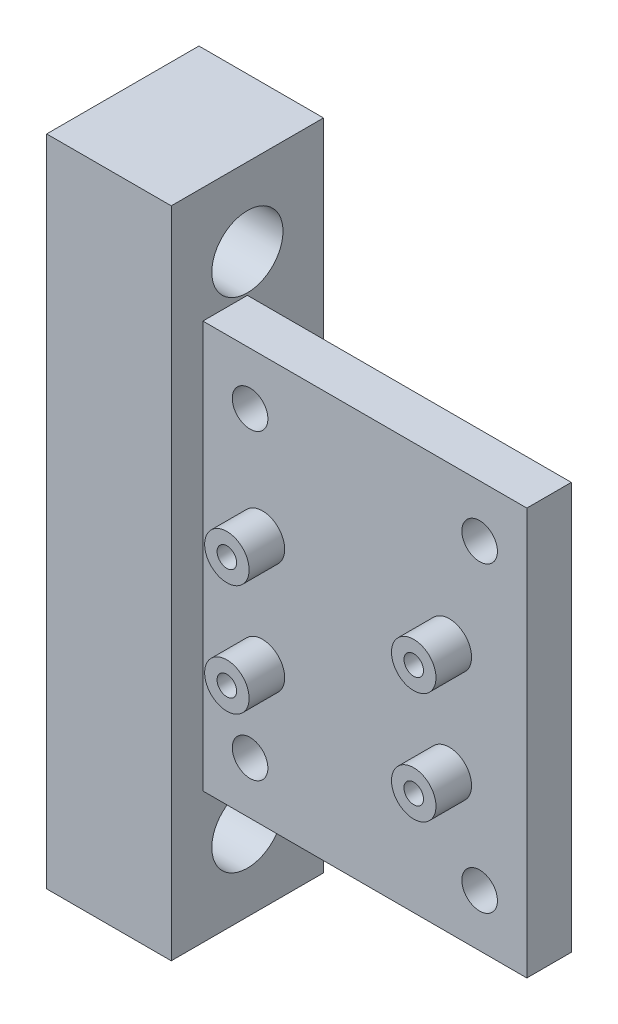
ISO-10303-21;
HEADER;
FILE_DESCRIPTION(('STEP AP214'),'2;1');
FILE_NAME('part.step','',(''),(''),'','','');
FILE_SCHEMA(('AUTOMOTIVE_DESIGN { 1 0 10303 214 1 1 1 1 }'));
ENDSEC;
DATA;
#1=APPLICATION_CONTEXT('core data for automotive mechanical design processes');
#2=APPLICATION_PROTOCOL_DEFINITION('international standard','automotive_design',2000,#1);
#3=PRODUCT_CONTEXT('',#1,'mechanical');
#4=PRODUCT('Part','Part','',(#3));
#5=PRODUCT_RELATED_PRODUCT_CATEGORY('part','',(#4));
#6=PRODUCT_DEFINITION_FORMATION('','',#4);
#7=PRODUCT_DEFINITION_CONTEXT('part definition',#1,'design');
#8=PRODUCT_DEFINITION('design','',#6,#7);
#9=PRODUCT_DEFINITION_SHAPE('','',#8);
#10=(LENGTH_UNIT() NAMED_UNIT(*) SI_UNIT(.MILLI.,.METRE.));
#11=(NAMED_UNIT(*) PLANE_ANGLE_UNIT() SI_UNIT($,.RADIAN.));
#12=(NAMED_UNIT(*) SI_UNIT($,.STERADIAN.) SOLID_ANGLE_UNIT());
#13=UNCERTAINTY_MEASURE_WITH_UNIT(LENGTH_MEASURE(1.E-05),#10,'distance_accuracy_value','');
#14=(GEOMETRIC_REPRESENTATION_CONTEXT(3) GLOBAL_UNCERTAINTY_ASSIGNED_CONTEXT((#13)) GLOBAL_UNIT_ASSIGNED_CONTEXT((#10,
#11,#12)) REPRESENTATION_CONTEXT('',''));
#15=CARTESIAN_POINT('',(0.,0.,0.));
#16=DIRECTION('',(0.,0.,1.));
#17=DIRECTION('',(1.,0.,0.));
#18=AXIS2_PLACEMENT_3D('',#15,#16,#17);
#19=CARTESIAN_POINT('',(0.,-21.9872067312742,5.));
#20=DIRECTION('',(0.,1.,0.));
#21=DIRECTION('',(0.,0.,1.));
#22=AXIS2_PLACEMENT_3D('',#19,#20,#21);
#23=PLANE('',#22);
#24=DIRECTION('',(1.,0.,0.));
#25=VECTOR('',#24,1.);
#26=CARTESIAN_POINT('',(0.,-21.9872067312742,0.));
#27=LINE('',#26,#25);
#28=CARTESIAN_POINT('',(-17.8933097400402,-21.9872067312742,0.));
#29=VERTEX_POINT('',#28);
#30=CARTESIAN_POINT('',(18.5125065993497,-21.9872067312742,0.));
#31=VERTEX_POINT('',#30);
#32=EDGE_CURVE('E217',#29,#31,#27,.T.);
#33=ORIENTED_EDGE('',*,*,#32,.T.);
#34=DIRECTION('',(0.,0.,-1.));
#35=VECTOR('',#34,1.);
#36=CARTESIAN_POINT('',(18.5125065993497,-21.9872067312742,5.));
#37=LINE('',#36,#35);
#38=CARTESIAN_POINT('',(18.5125065993497,-21.9872067312742,5.));
#39=VERTEX_POINT('',#38);
#40=EDGE_CURVE('E11',#39,#31,#37,.T.);
#41=ORIENTED_EDGE('',*,*,#40,.F.);
#42=DIRECTION('',(1.,0.,0.));
#43=VECTOR('',#42,1.);
#44=CARTESIAN_POINT('',(0.,-21.9872067312742,5.));
#45=LINE('',#44,#43);
#46=CARTESIAN_POINT('',(-17.8933097400402,-21.9872067312742,5.));
#47=VERTEX_POINT('',#46);
#48=EDGE_CURVE('E60',#47,#39,#45,.T.);
#49=ORIENTED_EDGE('',*,*,#48,.F.);
#50=DIRECTION('',(0.,0.,-1.));
#51=VECTOR('',#50,1.);
#52=CARTESIAN_POINT('',(-17.8933097400402,-21.9872067312742,5.));
#53=LINE('',#52,#51);
#54=EDGE_CURVE('E80',#47,#29,#53,.T.);
#55=ORIENTED_EDGE('',*,*,#54,.T.);
#56=EDGE_LOOP('',(#33,#41,#49,#55));
#57=FACE_BOUND('',#56,.T.);
#58=ADVANCED_FACE('F41',(#57),#23,.F.);
#59=CARTESIAN_POINT('',(18.5125065993497,0.,5.));
#60=DIRECTION('',(-1.,0.,0.));
#61=DIRECTION('',(0.,0.,1.));
#62=AXIS2_PLACEMENT_3D('',#59,#60,#61);
#63=PLANE('',#62);
#64=DIRECTION('',(0.,1.,0.));
#65=VECTOR('',#64,1.);
#66=CARTESIAN_POINT('',(18.5125065993497,0.,0.));
#67=LINE('',#66,#65);
#68=CARTESIAN_POINT('',(18.5125065993497,23.7506839774819,0.));
#69=VERTEX_POINT('',#68);
#70=EDGE_CURVE('E219',#31,#69,#67,.T.);
#71=ORIENTED_EDGE('',*,*,#70,.T.);
#72=DIRECTION('',(0.,0.,-1.));
#73=VECTOR('',#72,1.);
#74=CARTESIAN_POINT('',(18.5125065993497,23.7506839774819,5.));
#75=LINE('',#74,#73);
#76=CARTESIAN_POINT('',(18.5125065993497,23.7506839774819,5.));
#77=VERTEX_POINT('',#76);
#78=EDGE_CURVE('E51',#77,#69,#75,.T.);
#79=ORIENTED_EDGE('',*,*,#78,.F.);
#80=DIRECTION('',(0.,1.,0.));
#81=VECTOR('',#80,1.);
#82=CARTESIAN_POINT('',(18.5125065993497,0.,5.));
#83=LINE('',#82,#81);
#84=EDGE_CURVE('E86',#39,#77,#83,.T.);
#85=ORIENTED_EDGE('',*,*,#84,.F.);
#86=ORIENTED_EDGE('',*,*,#40,.T.);
#87=EDGE_LOOP('',(#71,#79,#85,#86));
#88=FACE_BOUND('',#87,.T.);
#89=ADVANCED_FACE('F281',(#88),#63,.F.);
#90=CARTESIAN_POINT('',(0.,23.7506839774819,5.));
#91=DIRECTION('',(0.,1.,0.));
#92=DIRECTION('',(0.,0.,1.));
#93=AXIS2_PLACEMENT_3D('',#90,#91,#92);
#94=PLANE('',#93);
#95=DIRECTION('',(1.,0.,0.));
#96=VECTOR('',#95,1.);
#97=CARTESIAN_POINT('',(0.,23.7506839774819,0.));
#98=LINE('',#97,#96);
#99=CARTESIAN_POINT('',(-17.8933097400402,23.7506839774819,0.));
#100=VERTEX_POINT('',#99);
#101=EDGE_CURVE('E221',#100,#69,#98,.T.);
#102=ORIENTED_EDGE('',*,*,#101,.F.);
#103=DIRECTION('',(0.,0.,-1.));
#104=VECTOR('',#103,1.);
#105=CARTESIAN_POINT('',(-17.8933097400402,23.7506839774819,5.));
#106=LINE('',#105,#104);
#107=CARTESIAN_POINT('',(-17.8933097400402,23.7506839774819,5.));
#108=VERTEX_POINT('',#107);
#109=EDGE_CURVE('E235',#108,#100,#106,.T.);
#110=ORIENTED_EDGE('',*,*,#109,.F.);
#111=DIRECTION('',(1.,0.,0.));
#112=VECTOR('',#111,1.);
#113=CARTESIAN_POINT('',(0.,23.7506839774819,5.));
#114=LINE('',#113,#112);
#115=EDGE_CURVE('E198',#108,#77,#114,.T.);
#116=ORIENTED_EDGE('',*,*,#115,.T.);
#117=ORIENTED_EDGE('',*,*,#78,.T.);
#118=EDGE_LOOP('',(#102,#110,#116,#117));
#119=FACE_BOUND('',#118,.T.);
#120=ADVANCED_FACE('F286',(#119),#94,.T.);
#121=CARTESIAN_POINT('',(9.80189714610748,6.1240373395566,5.));
#122=DIRECTION('',(0.,0.,-1.));
#123=DIRECTION('',(-1.,0.,0.));
#124=AXIS2_PLACEMENT_3D('',#121,#122,#123);
#125=CYLINDRICAL_SURFACE('',#124,1.1);
#126=CARTESIAN_POINT('',(9.80189714610748,6.1240373395566,0.));
#127=DIRECTION('',(0.,0.,1.));
#128=DIRECTION('',(1.,0.,0.));
#129=AXIS2_PLACEMENT_3D('',#126,#127,#128);
#130=CIRCLE('',#129,1.1);
#131=CARTESIAN_POINT('',(10.9018971461075,6.1240373395566,0.));
#132=VERTEX_POINT('',#131);
#133=EDGE_CURVE('E229',#132,#132,#130,.T.);
#134=ORIENTED_EDGE('',*,*,#133,.F.);
#135=EDGE_LOOP('',(#134));
#136=FACE_BOUND('',#135,.T.);
#137=CARTESIAN_POINT('',(9.80189714610748,6.1240373395566,9.));
#138=DIRECTION('',(0.,0.,1.));
#139=DIRECTION('',(1.,0.,0.));
#140=AXIS2_PLACEMENT_3D('',#137,#138,#139);
#141=CIRCLE('',#140,1.1);
#142=CARTESIAN_POINT('',(10.9018971461075,6.1240373395566,9.));
#143=VERTEX_POINT('',#142);
#144=EDGE_CURVE('E141',#143,#143,#141,.T.);
#145=ORIENTED_EDGE('',*,*,#144,.T.);
#146=EDGE_LOOP('',(#145));
#147=FACE_BOUND('',#146,.T.);
#148=ADVANCED_FACE('F483',(#136,#147),#125,.F.);
#149=CARTESIAN_POINT('',(-11.1981028538925,6.1240373395566,5.));
#150=DIRECTION('',(0.,0.,-1.));
#151=DIRECTION('',(-1.,0.,0.));
#152=AXIS2_PLACEMENT_3D('',#149,#150,#151);
#153=CYLINDRICAL_SURFACE('',#152,1.1);
#154=CARTESIAN_POINT('',(-11.1981028538925,6.1240373395566,0.));
#155=DIRECTION('',(0.,0.,1.));
#156=DIRECTION('',(1.,0.,0.));
#157=AXIS2_PLACEMENT_3D('',#154,#155,#156);
#158=CIRCLE('',#157,1.1);
#159=CARTESIAN_POINT('',(-10.0981028538925,6.1240373395566,0.));
#160=VERTEX_POINT('',#159);
#161=EDGE_CURVE('E226',#160,#160,#158,.T.);
#162=ORIENTED_EDGE('',*,*,#161,.F.);
#163=EDGE_LOOP('',(#162));
#164=FACE_BOUND('',#163,.T.);
#165=CARTESIAN_POINT('',(-11.1981028538925,6.1240373395566,9.));
#166=DIRECTION('',(0.,0.,1.));
#167=DIRECTION('',(1.,0.,0.));
#168=AXIS2_PLACEMENT_3D('',#165,#166,#167);
#169=CIRCLE('',#168,1.1);
#170=CARTESIAN_POINT('',(-10.0981028538925,6.1240373395566,9.));
#171=VERTEX_POINT('',#170);
#172=EDGE_CURVE('E155',#171,#171,#169,.T.);
#173=ORIENTED_EDGE('',*,*,#172,.T.);
#174=EDGE_LOOP('',(#173));
#175=FACE_BOUND('',#174,.T.);
#176=ADVANCED_FACE('F294',(#164,#175),#153,.F.);
#177=CARTESIAN_POINT('',(-12.5904015703453,17.8817386231038,5.));
#178=DIRECTION('',(0.,0.,-1.));
#179=DIRECTION('',(-1.,0.,0.));
#180=AXIS2_PLACEMENT_3D('',#177,#178,#179);
#181=CYLINDRICAL_SURFACE('',#180,2.);
#182=CARTESIAN_POINT('',(-12.5904015703453,17.8817386231038,5.));
#183=DIRECTION('',(0.,0.,1.));
#184=DIRECTION('',(1.,0.,0.));
#185=AXIS2_PLACEMENT_3D('',#182,#183,#184);
#186=CIRCLE('',#185,2.);
#187=CARTESIAN_POINT('',(-10.5904015703453,17.8817386231038,5.));
#188=VERTEX_POINT('',#187);
#189=EDGE_CURVE('E193',#188,#188,#186,.T.);
#190=ORIENTED_EDGE('',*,*,#189,.T.);
#191=EDGE_LOOP('',(#190));
#192=FACE_BOUND('',#191,.T.);
#193=CARTESIAN_POINT('',(-12.5904015703453,17.8817386231038,0.));
#194=DIRECTION('',(0.,0.,1.));
#195=DIRECTION('',(1.,0.,0.));
#196=AXIS2_PLACEMENT_3D('',#193,#194,#195);
#197=CIRCLE('',#196,2.);
#198=CARTESIAN_POINT('',(-10.5904015703453,17.8817386231038,0.));
#199=VERTEX_POINT('',#198);
#200=EDGE_CURVE('E214',#199,#199,#197,.T.);
#201=ORIENTED_EDGE('',*,*,#200,.F.);
#202=EDGE_LOOP('',(#201));
#203=FACE_BOUND('',#202,.T.);
#204=ADVANCED_FACE('F290',(#192,#203),#181,.F.);
#205=CARTESIAN_POINT('',(13.2095984296548,17.8817386231039,5.));
#206=DIRECTION('',(0.,0.,-1.));
#207=DIRECTION('',(-1.,0.,0.));
#208=AXIS2_PLACEMENT_3D('',#205,#206,#207);
#209=CYLINDRICAL_SURFACE('',#208,1.99999999999996);
#210=CARTESIAN_POINT('',(13.2095984296548,17.8817386231039,5.));
#211=DIRECTION('',(0.,0.,1.));
#212=DIRECTION('',(1.,0.,0.));
#213=AXIS2_PLACEMENT_3D('',#210,#211,#212);
#214=CIRCLE('',#213,1.99999999999996);
#215=CARTESIAN_POINT('',(15.2095984296547,17.8817386231039,5.));
#216=VERTEX_POINT('',#215);
#217=EDGE_CURVE('E190',#216,#216,#214,.T.);
#218=ORIENTED_EDGE('',*,*,#217,.T.);
#219=EDGE_LOOP('',(#218));
#220=FACE_BOUND('',#219,.T.);
#221=CARTESIAN_POINT('',(13.2095984296548,17.8817386231039,0.));
#222=DIRECTION('',(0.,0.,1.));
#223=DIRECTION('',(1.,0.,0.));
#224=AXIS2_PLACEMENT_3D('',#221,#222,#223);
#225=CIRCLE('',#224,1.99999999999996);
#226=CARTESIAN_POINT('',(15.2095984296547,17.8817386231039,0.));
#227=VERTEX_POINT('',#226);
#228=EDGE_CURVE('E211',#227,#227,#225,.T.);
#229=ORIENTED_EDGE('',*,*,#228,.F.);
#230=EDGE_LOOP('',(#229));
#231=FACE_BOUND('',#230,.T.);
#232=ADVANCED_FACE('F293',(#220,#231),#209,.F.);
#233=CARTESIAN_POINT('',(13.2095984296548,-16.1182613768961,5.));
#234=DIRECTION('',(0.,0.,-1.));
#235=DIRECTION('',(-1.,0.,0.));
#236=AXIS2_PLACEMENT_3D('',#233,#234,#235);
#237=CYLINDRICAL_SURFACE('',#236,2.);
#238=CARTESIAN_POINT('',(13.2095984296548,-16.1182613768961,5.));
#239=DIRECTION('',(0.,0.,1.));
#240=DIRECTION('',(1.,0.,0.));
#241=AXIS2_PLACEMENT_3D('',#238,#239,#240);
#242=CIRCLE('',#241,2.);
#243=CARTESIAN_POINT('',(15.2095984296548,-16.1182613768961,5.));
#244=VERTEX_POINT('',#243);
#245=EDGE_CURVE('E186',#244,#244,#242,.T.);
#246=ORIENTED_EDGE('',*,*,#245,.T.);
#247=EDGE_LOOP('',(#246));
#248=FACE_BOUND('',#247,.T.);
#249=CARTESIAN_POINT('',(13.2095984296548,-16.1182613768961,0.));
#250=DIRECTION('',(0.,0.,1.));
#251=DIRECTION('',(1.,0.,0.));
#252=AXIS2_PLACEMENT_3D('',#249,#250,#251);
#253=CIRCLE('',#252,2.);
#254=CARTESIAN_POINT('',(15.2095984296548,-16.1182613768961,0.));
#255=VERTEX_POINT('',#254);
#256=EDGE_CURVE('E208',#255,#255,#253,.T.);
#257=ORIENTED_EDGE('',*,*,#256,.F.);
#258=EDGE_LOOP('',(#257));
#259=FACE_BOUND('',#258,.T.);
#260=ADVANCED_FACE('F298',(#248,#259),#237,.F.);
#261=CARTESIAN_POINT('',(-12.5904015703453,-16.1182613768961,5.));
#262=DIRECTION('',(0.,0.,-1.));
#263=DIRECTION('',(-1.,0.,0.));
#264=AXIS2_PLACEMENT_3D('',#261,#262,#263);
#265=CYLINDRICAL_SURFACE('',#264,1.99999999999999);
#266=CARTESIAN_POINT('',(-12.5904015703453,-16.1182613768961,5.));
#267=DIRECTION('',(0.,0.,1.));
#268=DIRECTION('',(1.,0.,0.));
#269=AXIS2_PLACEMENT_3D('',#266,#267,#268);
#270=CIRCLE('',#269,1.99999999999999);
#271=CARTESIAN_POINT('',(-10.5904015703453,-16.1182613768961,5.));
#272=VERTEX_POINT('',#271);
#273=EDGE_CURVE('E183',#272,#272,#270,.T.);
#274=ORIENTED_EDGE('',*,*,#273,.T.);
#275=EDGE_LOOP('',(#274));
#276=FACE_BOUND('',#275,.T.);
#277=CARTESIAN_POINT('',(-12.5904015703453,-16.1182613768961,0.));
#278=DIRECTION('',(0.,0.,1.));
#279=DIRECTION('',(1.,0.,0.));
#280=AXIS2_PLACEMENT_3D('',#277,#278,#279);
#281=CIRCLE('',#280,1.99999999999999);
#282=CARTESIAN_POINT('',(-10.5904015703453,-16.1182613768961,0.));
#283=VERTEX_POINT('',#282);
#284=EDGE_CURVE('E205',#283,#283,#281,.T.);
#285=ORIENTED_EDGE('',*,*,#284,.F.);
#286=EDGE_LOOP('',(#285));
#287=FACE_BOUND('',#286,.T.);
#288=ADVANCED_FACE('F301',(#276,#287),#265,.F.);
#289=CARTESIAN_POINT('',(-11.1981028538925,-6.37596266044342,5.));
#290=DIRECTION('',(0.,0.,-1.));
#291=DIRECTION('',(-1.,0.,0.));
#292=AXIS2_PLACEMENT_3D('',#289,#290,#291);
#293=CYLINDRICAL_SURFACE('',#292,1.1);
#294=CARTESIAN_POINT('',(-11.1981028538925,-6.37596266044342,0.));
#295=DIRECTION('',(0.,0.,1.));
#296=DIRECTION('',(1.,0.,0.));
#297=AXIS2_PLACEMENT_3D('',#294,#295,#296);
#298=CIRCLE('',#297,1.1);
#299=CARTESIAN_POINT('',(-10.0981028538925,-6.37596266044342,0.));
#300=VERTEX_POINT('',#299);
#301=EDGE_CURVE('E180',#300,#300,#298,.T.);
#302=ORIENTED_EDGE('',*,*,#301,.F.);
#303=EDGE_LOOP('',(#302));
#304=FACE_BOUND('',#303,.T.);
#305=CARTESIAN_POINT('',(-11.1981028538925,-6.37596266044342,9.));
#306=DIRECTION('',(0.,0.,1.));
#307=DIRECTION('',(1.,0.,0.));
#308=AXIS2_PLACEMENT_3D('',#305,#306,#307);
#309=CIRCLE('',#308,1.1);
#310=CARTESIAN_POINT('',(-10.0981028538925,-6.37596266044342,9.));
#311=VERTEX_POINT('',#310);
#312=EDGE_CURVE('E152',#311,#311,#309,.T.);
#313=ORIENTED_EDGE('',*,*,#312,.T.);
#314=EDGE_LOOP('',(#313));
#315=FACE_BOUND('',#314,.T.);
#316=ADVANCED_FACE('F43',(#304,#315),#293,.F.);
#317=CARTESIAN_POINT('',(9.80189714610748,-6.37596266044337,5.));
#318=DIRECTION('',(0.,0.,-1.));
#319=DIRECTION('',(-1.,0.,0.));
#320=AXIS2_PLACEMENT_3D('',#317,#318,#319);
#321=CYLINDRICAL_SURFACE('',#320,1.1);
#322=CARTESIAN_POINT('',(9.80189714610748,-6.37596266044337,0.));
#323=DIRECTION('',(0.,0.,1.));
#324=DIRECTION('',(1.,0.,0.));
#325=AXIS2_PLACEMENT_3D('',#322,#323,#324);
#326=CIRCLE('',#325,1.1);
#327=CARTESIAN_POINT('',(10.9018971461075,-6.37596266044337,0.));
#328=VERTEX_POINT('',#327);
#329=EDGE_CURVE('E187',#328,#328,#326,.T.);
#330=ORIENTED_EDGE('',*,*,#329,.F.);
#331=EDGE_LOOP('',(#330));
#332=FACE_BOUND('',#331,.T.);
#333=CARTESIAN_POINT('',(9.80189714610748,-6.37596266044337,9.));
#334=DIRECTION('',(0.,0.,1.));
#335=DIRECTION('',(1.,0.,0.));
#336=AXIS2_PLACEMENT_3D('',#333,#334,#335);
#337=CIRCLE('',#336,1.1);
#338=CARTESIAN_POINT('',(10.9018971461075,-6.37596266044337,9.));
#339=VERTEX_POINT('',#338);
#340=EDGE_CURVE('E144',#339,#339,#337,.T.);
#341=ORIENTED_EDGE('',*,*,#340,.T.);
#342=EDGE_LOOP('',(#341));
#343=FACE_BOUND('',#342,.T.);
#344=ADVANCED_FACE('F308',(#332,#343),#321,.F.);
#345=CARTESIAN_POINT('',(0.,0.,5.));
#346=DIRECTION('',(0.,0.,1.));
#347=DIRECTION('',(1.,0.,0.));
#348=AXIS2_PLACEMENT_3D('',#345,#346,#347);
#349=PLANE('',#348);
#350=CARTESIAN_POINT('',(9.80189714610748,6.1240373395566,5.));
#351=DIRECTION('',(0.,0.,1.));
#352=DIRECTION('',(1.,0.,0.));
#353=AXIS2_PLACEMENT_3D('',#350,#351,#352);
#354=CIRCLE('',#353,2.5);
#355=CARTESIAN_POINT('',(12.3018971461075,6.1240373395566,5.));
#356=VERTEX_POINT('',#355);
#357=EDGE_CURVE('E159',#356,#356,#354,.T.);
#358=ORIENTED_EDGE('',*,*,#357,.F.);
#359=EDGE_LOOP('',(#358));
#360=FACE_BOUND('',#359,.T.);
#361=CARTESIAN_POINT('',(9.80189714610748,-6.37596266044337,5.));
#362=DIRECTION('',(0.,0.,1.));
#363=DIRECTION('',(1.,0.,0.));
#364=AXIS2_PLACEMENT_3D('',#361,#362,#363);
#365=CIRCLE('',#364,2.5);
#366=CARTESIAN_POINT('',(12.3018971461075,-6.37596266044337,5.));
#367=VERTEX_POINT('',#366);
#368=EDGE_CURVE('E165',#367,#367,#365,.T.);
#369=ORIENTED_EDGE('',*,*,#368,.F.);
#370=EDGE_LOOP('',(#369));
#371=FACE_BOUND('',#370,.T.);
#372=CARTESIAN_POINT('',(-11.1981028538925,-6.37596266044342,5.));
#373=DIRECTION('',(0.,0.,1.));
#374=DIRECTION('',(1.,0.,0.));
#375=AXIS2_PLACEMENT_3D('',#372,#373,#374);
#376=CIRCLE('',#375,2.5);
#377=CARTESIAN_POINT('',(-8.69810285389252,-6.37596266044342,5.));
#378=VERTEX_POINT('',#377);
#379=EDGE_CURVE('E171',#378,#378,#376,.T.);
#380=ORIENTED_EDGE('',*,*,#379,.F.);
#381=EDGE_LOOP('',(#380));
#382=FACE_BOUND('',#381,.T.);
#383=CARTESIAN_POINT('',(-11.1981028538925,6.1240373395566,5.));
#384=DIRECTION('',(0.,0.,1.));
#385=DIRECTION('',(1.,0.,0.));
#386=AXIS2_PLACEMENT_3D('',#383,#384,#385);
#387=CIRCLE('',#386,2.5);
#388=CARTESIAN_POINT('',(-8.69810285389252,6.1240373395566,5.));
#389=VERTEX_POINT('',#388);
#390=EDGE_CURVE('E174',#389,#389,#387,.T.);
#391=ORIENTED_EDGE('',*,*,#390,.F.);
#392=EDGE_LOOP('',(#391));
#393=FACE_BOUND('',#392,.T.);
#394=ORIENTED_EDGE('',*,*,#273,.F.);
#395=EDGE_LOOP('',(#394));
#396=FACE_BOUND('',#395,.T.);
#397=ORIENTED_EDGE('',*,*,#245,.F.);
#398=EDGE_LOOP('',(#397));
#399=FACE_BOUND('',#398,.T.);
#400=ORIENTED_EDGE('',*,*,#217,.F.);
#401=EDGE_LOOP('',(#400));
#402=FACE_BOUND('',#401,.T.);
#403=ORIENTED_EDGE('',*,*,#189,.F.);
#404=EDGE_LOOP('',(#403));
#405=FACE_BOUND('',#404,.T.);
#406=ORIENTED_EDGE('',*,*,#48,.T.);
#407=ORIENTED_EDGE('',*,*,#84,.T.);
#408=ORIENTED_EDGE('',*,*,#115,.F.);
#409=DIRECTION('',(0.,1.,0.));
#410=VECTOR('',#409,1.);
#411=CARTESIAN_POINT('',(-17.8933097400402,0.,5.));
#412=LINE('',#411,#410);
#413=EDGE_CURVE('E200',#47,#108,#412,.T.);
#414=ORIENTED_EDGE('',*,*,#413,.F.);
#415=EDGE_LOOP('',(#406,#407,#408,#414));
#416=FACE_BOUND('',#415,.T.);
#417=ADVANCED_FACE('F318',(#360,#371,#382,#393,#396,#399,#402,#405,#416),#349,.T.);
#418=CARTESIAN_POINT('',(0.,0.,0.));
#419=DIRECTION('',(0.,0.,1.));
#420=DIRECTION('',(1.,0.,0.));
#421=AXIS2_PLACEMENT_3D('',#418,#419,#420);
#422=PLANE('',#421);
#423=ORIENTED_EDGE('',*,*,#301,.T.);
#424=EDGE_LOOP('',(#423));
#425=FACE_BOUND('',#424,.T.);
#426=ORIENTED_EDGE('',*,*,#284,.T.);
#427=EDGE_LOOP('',(#426));
#428=FACE_BOUND('',#427,.T.);
#429=ORIENTED_EDGE('',*,*,#256,.T.);
#430=EDGE_LOOP('',(#429));
#431=FACE_BOUND('',#430,.T.);
#432=ORIENTED_EDGE('',*,*,#228,.T.);
#433=EDGE_LOOP('',(#432));
#434=FACE_BOUND('',#433,.T.);
#435=ORIENTED_EDGE('',*,*,#200,.T.);
#436=EDGE_LOOP('',(#435));
#437=FACE_BOUND('',#436,.T.);
#438=ORIENTED_EDGE('',*,*,#32,.F.);
#439=DIRECTION('',(0.,1.,0.));
#440=VECTOR('',#439,1.);
#441=CARTESIAN_POINT('',(-17.8933097400402,0.,0.));
#442=LINE('',#441,#440);
#443=EDGE_CURVE('E224',#29,#100,#442,.T.);
#444=ORIENTED_EDGE('',*,*,#443,.T.);
#445=ORIENTED_EDGE('',*,*,#101,.T.);
#446=ORIENTED_EDGE('',*,*,#70,.F.);
#447=EDGE_LOOP('',(#438,#444,#445,#446));
#448=FACE_BOUND('',#447,.T.);
#449=ORIENTED_EDGE('',*,*,#161,.T.);
#450=EDGE_LOOP('',(#449));
#451=FACE_BOUND('',#450,.T.);
#452=ORIENTED_EDGE('',*,*,#133,.T.);
#453=EDGE_LOOP('',(#452));
#454=FACE_BOUND('',#453,.T.);
#455=ORIENTED_EDGE('',*,*,#329,.T.);
#456=EDGE_LOOP('',(#455));
#457=FACE_BOUND('',#456,.T.);
#458=ADVANCED_FACE('F314',(#425,#428,#431,#434,#437,#448,#451,#454,#457),#422,.F.);
#459=CARTESIAN_POINT('',(-11.1981028538925,6.1240373395566,9.));
#460=DIRECTION('',(0.,0.,1.));
#461=DIRECTION('',(1.,0.,0.));
#462=AXIS2_PLACEMENT_3D('',#459,#460,#461);
#463=PLANE('',#462);
#464=ORIENTED_EDGE('',*,*,#172,.F.);
#465=EDGE_LOOP('',(#464));
#466=FACE_BOUND('',#465,.T.);
#467=CARTESIAN_POINT('',(-11.1981028538925,6.1240373395566,9.));
#468=DIRECTION('',(0.,0.,1.));
#469=DIRECTION('',(1.,0.,0.));
#470=AXIS2_PLACEMENT_3D('',#467,#468,#469);
#471=CIRCLE('',#470,2.5);
#472=CARTESIAN_POINT('',(-8.69810285389252,6.1240373395566,9.));
#473=VERTEX_POINT('',#472);
#474=EDGE_CURVE('E177',#473,#473,#471,.T.);
#475=ORIENTED_EDGE('',*,*,#474,.T.);
#476=EDGE_LOOP('',(#475));
#477=FACE_BOUND('',#476,.T.);
#478=ADVANCED_FACE('F317',(#466,#477),#463,.T.);
#479=CARTESIAN_POINT('',(-11.1981028538925,6.1240373395566,9.));
#480=DIRECTION('',(0.,0.,-1.));
#481=DIRECTION('',(-1.,0.,0.));
#482=AXIS2_PLACEMENT_3D('',#479,#480,#481);
#483=CYLINDRICAL_SURFACE('',#482,2.5);
#484=ORIENTED_EDGE('',*,*,#474,.F.);
#485=EDGE_LOOP('',(#484));
#486=FACE_BOUND('',#485,.T.);
#487=ORIENTED_EDGE('',*,*,#390,.T.);
#488=EDGE_LOOP('',(#487));
#489=FACE_BOUND('',#488,.T.);
#490=ADVANCED_FACE('F523',(#486,#489),#483,.T.);
#491=CARTESIAN_POINT('',(-11.1981028538925,-6.37596266044342,9.));
#492=DIRECTION('',(0.,0.,1.));
#493=DIRECTION('',(1.,0.,0.));
#494=AXIS2_PLACEMENT_3D('',#491,#492,#493);
#495=PLANE('',#494);
#496=ORIENTED_EDGE('',*,*,#312,.F.);
#497=EDGE_LOOP('',(#496));
#498=FACE_BOUND('',#497,.T.);
#499=CARTESIAN_POINT('',(-11.1981028538925,-6.37596266044342,9.));
#500=DIRECTION('',(0.,0.,1.));
#501=DIRECTION('',(1.,0.,0.));
#502=AXIS2_PLACEMENT_3D('',#499,#500,#501);
#503=CIRCLE('',#502,2.5);
#504=CARTESIAN_POINT('',(-8.69810285389252,-6.37596266044342,9.));
#505=VERTEX_POINT('',#504);
#506=EDGE_CURVE('E168',#505,#505,#503,.T.);
#507=ORIENTED_EDGE('',*,*,#506,.T.);
#508=EDGE_LOOP('',(#507));
#509=FACE_BOUND('',#508,.T.);
#510=ADVANCED_FACE('F518',(#498,#509),#495,.T.);
#511=CARTESIAN_POINT('',(-11.1981028538925,-6.37596266044342,9.));
#512=DIRECTION('',(0.,0.,-1.));
#513=DIRECTION('',(-1.,0.,0.));
#514=AXIS2_PLACEMENT_3D('',#511,#512,#513);
#515=CYLINDRICAL_SURFACE('',#514,2.5);
#516=ORIENTED_EDGE('',*,*,#506,.F.);
#517=EDGE_LOOP('',(#516));
#518=FACE_BOUND('',#517,.T.);
#519=ORIENTED_EDGE('',*,*,#379,.T.);
#520=EDGE_LOOP('',(#519));
#521=FACE_BOUND('',#520,.T.);
#522=ADVANCED_FACE('F344',(#518,#521),#515,.T.);
#523=CARTESIAN_POINT('',(9.80189714610748,-6.37596266044337,9.));
#524=DIRECTION('',(0.,0.,1.));
#525=DIRECTION('',(1.,0.,0.));
#526=AXIS2_PLACEMENT_3D('',#523,#524,#525);
#527=PLANE('',#526);
#528=ORIENTED_EDGE('',*,*,#340,.F.);
#529=EDGE_LOOP('',(#528));
#530=FACE_BOUND('',#529,.T.);
#531=CARTESIAN_POINT('',(9.80189714610748,-6.37596266044337,9.));
#532=DIRECTION('',(0.,0.,1.));
#533=DIRECTION('',(1.,0.,0.));
#534=AXIS2_PLACEMENT_3D('',#531,#532,#533);
#535=CIRCLE('',#534,2.5);
#536=CARTESIAN_POINT('',(12.3018971461075,-6.37596266044337,9.));
#537=VERTEX_POINT('',#536);
#538=EDGE_CURVE('E162',#537,#537,#535,.T.);
#539=ORIENTED_EDGE('',*,*,#538,.T.);
#540=EDGE_LOOP('',(#539));
#541=FACE_BOUND('',#540,.T.);
#542=ADVANCED_FACE('F340',(#530,#541),#527,.T.);
#543=CARTESIAN_POINT('',(9.80189714610748,-6.37596266044337,9.));
#544=DIRECTION('',(0.,0.,-1.));
#545=DIRECTION('',(-1.,0.,0.));
#546=AXIS2_PLACEMENT_3D('',#543,#544,#545);
#547=CYLINDRICAL_SURFACE('',#546,2.5);
#548=ORIENTED_EDGE('',*,*,#538,.F.);
#549=EDGE_LOOP('',(#548));
#550=FACE_BOUND('',#549,.T.);
#551=ORIENTED_EDGE('',*,*,#368,.T.);
#552=EDGE_LOOP('',(#551));
#553=FACE_BOUND('',#552,.T.);
#554=ADVANCED_FACE('F343',(#550,#553),#547,.T.);
#555=CARTESIAN_POINT('',(9.80189714610748,6.1240373395566,9.));
#556=DIRECTION('',(0.,0.,1.));
#557=DIRECTION('',(1.,0.,0.));
#558=AXIS2_PLACEMENT_3D('',#555,#556,#557);
#559=PLANE('',#558);
#560=ORIENTED_EDGE('',*,*,#144,.F.);
#561=EDGE_LOOP('',(#560));
#562=FACE_BOUND('',#561,.T.);
#563=CARTESIAN_POINT('',(9.80189714610748,6.1240373395566,9.));
#564=DIRECTION('',(0.,0.,1.));
#565=DIRECTION('',(1.,0.,0.));
#566=AXIS2_PLACEMENT_3D('',#563,#564,#565);
#567=CIRCLE('',#566,2.5);
#568=CARTESIAN_POINT('',(12.3018971461075,6.1240373395566,9.));
#569=VERTEX_POINT('',#568);
#570=EDGE_CURVE('E158',#569,#569,#567,.T.);
#571=ORIENTED_EDGE('',*,*,#570,.T.);
#572=EDGE_LOOP('',(#571));
#573=FACE_BOUND('',#572,.T.);
#574=ADVANCED_FACE('F350',(#562,#573),#559,.T.);
#575=CARTESIAN_POINT('',(9.80189714610748,6.1240373395566,9.));
#576=DIRECTION('',(0.,0.,-1.));
#577=DIRECTION('',(-1.,0.,0.));
#578=AXIS2_PLACEMENT_3D('',#575,#576,#577);
#579=CYLINDRICAL_SURFACE('',#578,2.5);
#580=ORIENTED_EDGE('',*,*,#570,.F.);
#581=EDGE_LOOP('',(#580));
#582=FACE_BOUND('',#581,.T.);
#583=ORIENTED_EDGE('',*,*,#357,.T.);
#584=EDGE_LOOP('',(#583));
#585=FACE_BOUND('',#584,.T.);
#586=ADVANCED_FACE('F371',(#582,#585),#579,.T.);
#587=CARTESIAN_POINT('',(-17.8933097400402,0.,0.));
#588=DIRECTION('',(1.,0.,0.));
#589=DIRECTION('',(0.,0.,-1.));
#590=AXIS2_PLACEMENT_3D('',#587,#588,#589);
#591=PLANE('',#590);
#592=CARTESIAN_POINT('',(-17.8933097400402,28.,0.));
#593=DIRECTION('',(1.,0.,0.));
#594=DIRECTION('',(0.,0.,-1.));
#595=AXIS2_PLACEMENT_3D('',#592,#593,#594);
#596=CIRCLE('',#595,4.);
#597=CARTESIAN_POINT('',(-17.8933097400402,28.,-4.));
#598=VERTEX_POINT('',#597);
#599=EDGE_CURVE('E248',#598,#598,#596,.T.);
#600=ORIENTED_EDGE('',*,*,#599,.F.);
#601=EDGE_LOOP('',(#600));
#602=FACE_BOUND('',#601,.T.);
#603=CARTESIAN_POINT('',(-17.8933097400402,-28.,0.));
#604=DIRECTION('',(1.,0.,0.));
#605=DIRECTION('',(0.,0.,-1.));
#606=AXIS2_PLACEMENT_3D('',#603,#604,#605);
#607=CIRCLE('',#606,4.);
#608=CARTESIAN_POINT('',(-17.8933097400402,-28.,-4.));
#609=VERTEX_POINT('',#608);
#610=EDGE_CURVE('E240',#609,#609,#607,.T.);
#611=ORIENTED_EDGE('',*,*,#610,.F.);
#612=EDGE_LOOP('',(#611));
#613=FACE_BOUND('',#612,.T.);
#614=DIRECTION('',(0.,1.,0.));
#615=VECTOR('',#614,1.);
#616=CARTESIAN_POINT('',(-17.8933097400402,-36.7419186876868,8.55542234444349));
#617=LINE('',#616,#615);
#618=CARTESIAN_POINT('',(-17.8933097400402,-36.7419186876868,8.55542234444349));
#619=VERTEX_POINT('',#618);
#620=CARTESIAN_POINT('',(-17.8933097400402,36.7419186876868,8.55542234444349));
#621=VERTEX_POINT('',#620);
#622=EDGE_CURVE('E140',#619,#621,#617,.T.);
#623=ORIENTED_EDGE('',*,*,#622,.F.);
#624=DIRECTION('',(0.,0.,1.));
#625=VECTOR('',#624,1.);
#626=CARTESIAN_POINT('',(-17.8933097400402,-36.7419186876868,-8.55542234444349));
#627=LINE('',#626,#625);
#628=CARTESIAN_POINT('',(-17.8933097400402,-36.7419186876868,-8.55542234444349));
#629=VERTEX_POINT('',#628);
#630=EDGE_CURVE('E136',#629,#619,#627,.T.);
#631=ORIENTED_EDGE('',*,*,#630,.F.);
#632=DIRECTION('',(0.,-1.,0.));
#633=VECTOR('',#632,1.);
#634=CARTESIAN_POINT('',(-17.8933097400402,-36.7419186876868,-8.55542234444349));
#635=LINE('',#634,#633);
#636=CARTESIAN_POINT('',(-17.8933097400402,36.7419186876868,-8.55542234444349));
#637=VERTEX_POINT('',#636);
#638=EDGE_CURVE('E258',#637,#629,#635,.T.);
#639=ORIENTED_EDGE('',*,*,#638,.F.);
#640=DIRECTION('',(0.,0.,-1.));
#641=VECTOR('',#640,1.);
#642=CARTESIAN_POINT('',(-17.8933097400402,36.7419186876868,-8.55542234444349));
#643=LINE('',#642,#641);
#644=EDGE_CURVE('E256',#621,#637,#643,.T.);
#645=ORIENTED_EDGE('',*,*,#644,.F.);
#646=EDGE_LOOP('',(#623,#631,#639,#645));
#647=FACE_BOUND('',#646,.T.);
#648=ORIENTED_EDGE('',*,*,#443,.F.);
#649=ORIENTED_EDGE('',*,*,#54,.F.);
#650=ORIENTED_EDGE('',*,*,#413,.T.);
#651=ORIENTED_EDGE('',*,*,#109,.T.);
#652=EDGE_LOOP('',(#648,#649,#650,#651));
#653=FACE_BOUND('',#652,.T.);
#654=ADVANCED_FACE('F269',(#602,#613,#647,#653),#591,.T.);
#655=CARTESIAN_POINT('',(-31.8933097400402,-36.7419186876868,8.55542234444349));
#656=DIRECTION('',(0.,0.,-1.));
#657=DIRECTION('',(-1.,0.,0.));
#658=AXIS2_PLACEMENT_3D('',#655,#656,#657);
#659=PLANE('',#658);
#660=ORIENTED_EDGE('',*,*,#622,.T.);
#661=DIRECTION('',(1.,0.,0.));
#662=VECTOR('',#661,1.);
#663=CARTESIAN_POINT('',(-31.8933097400402,36.7419186876868,8.55542234444349));
#664=LINE('',#663,#662);
#665=CARTESIAN_POINT('',(-31.8933097400402,36.7419186876868,8.55542234444349));
#666=VERTEX_POINT('',#665);
#667=EDGE_CURVE('E120',#666,#621,#664,.T.);
#668=ORIENTED_EDGE('',*,*,#667,.F.);
#669=DIRECTION('',(0.,1.,0.));
#670=VECTOR('',#669,1.);
#671=CARTESIAN_POINT('',(-31.8933097400402,-36.7419186876868,8.55542234444349));
#672=LINE('',#671,#670);
#673=CARTESIAN_POINT('',(-31.8933097400402,-36.7419186876868,8.55542234444349));
#674=VERTEX_POINT('',#673);
#675=EDGE_CURVE('E127',#674,#666,#672,.T.);
#676=ORIENTED_EDGE('',*,*,#675,.F.);
#677=DIRECTION('',(1.,0.,0.));
#678=VECTOR('',#677,1.);
#679=CARTESIAN_POINT('',(-31.8933097400402,-36.7419186876868,8.55542234444349));
#680=LINE('',#679,#678);
#681=EDGE_CURVE('E254',#674,#619,#680,.T.);
#682=ORIENTED_EDGE('',*,*,#681,.T.);
#683=EDGE_LOOP('',(#660,#668,#676,#682));
#684=FACE_BOUND('',#683,.T.);
#685=ADVANCED_FACE('F138',(#684),#659,.F.);
#686=CARTESIAN_POINT('',(-31.8933097400402,36.7419186876868,-8.55542234444349));
#687=DIRECTION('',(0.,-1.,0.));
#688=DIRECTION('',(0.,0.,-1.));
#689=AXIS2_PLACEMENT_3D('',#686,#687,#688);
#690=PLANE('',#689);
#691=ORIENTED_EDGE('',*,*,#644,.T.);
#692=DIRECTION('',(1.,0.,0.));
#693=VECTOR('',#692,1.);
#694=CARTESIAN_POINT('',(-31.8933097400402,36.7419186876868,-8.55542234444349));
#695=LINE('',#694,#693);
#696=CARTESIAN_POINT('',(-31.8933097400402,36.7419186876868,-8.55542234444349));
#697=VERTEX_POINT('',#696);
#698=EDGE_CURVE('E123',#697,#637,#695,.T.);
#699=ORIENTED_EDGE('',*,*,#698,.F.);
#700=DIRECTION('',(0.,0.,-1.));
#701=VECTOR('',#700,1.);
#702=CARTESIAN_POINT('',(-31.8933097400402,36.7419186876868,-8.55542234444349));
#703=LINE('',#702,#701);
#704=EDGE_CURVE('E116',#666,#697,#703,.T.);
#705=ORIENTED_EDGE('',*,*,#704,.F.);
#706=ORIENTED_EDGE('',*,*,#667,.T.);
#707=EDGE_LOOP('',(#691,#699,#705,#706));
#708=FACE_BOUND('',#707,.T.);
#709=ADVANCED_FACE('F118',(#708),#690,.F.);
#710=CARTESIAN_POINT('',(-31.8933097400402,-36.7419186876868,-8.55542234444349));
#711=DIRECTION('',(0.,0.,1.));
#712=DIRECTION('',(1.,0.,0.));
#713=AXIS2_PLACEMENT_3D('',#710,#711,#712);
#714=PLANE('',#713);
#715=ORIENTED_EDGE('',*,*,#638,.T.);
#716=DIRECTION('',(1.,0.,0.));
#717=VECTOR('',#716,1.);
#718=CARTESIAN_POINT('',(-31.8933097400402,-36.7419186876868,-8.55542234444349));
#719=LINE('',#718,#717);
#720=CARTESIAN_POINT('',(-31.8933097400402,-36.7419186876868,-8.55542234444349));
#721=VERTEX_POINT('',#720);
#722=EDGE_CURVE('E146',#721,#629,#719,.T.);
#723=ORIENTED_EDGE('',*,*,#722,.F.);
#724=DIRECTION('',(0.,-1.,0.));
#725=VECTOR('',#724,1.);
#726=CARTESIAN_POINT('',(-31.8933097400402,-36.7419186876868,-8.55542234444349));
#727=LINE('',#726,#725);
#728=EDGE_CURVE('E126',#697,#721,#727,.T.);
#729=ORIENTED_EDGE('',*,*,#728,.F.);
#730=ORIENTED_EDGE('',*,*,#698,.T.);
#731=EDGE_LOOP('',(#715,#723,#729,#730));
#732=FACE_BOUND('',#731,.T.);
#733=ADVANCED_FACE('F271',(#732),#714,.F.);
#734=CARTESIAN_POINT('',(-31.8933097400402,-36.7419186876868,-8.55542234444349));
#735=DIRECTION('',(0.,1.,0.));
#736=DIRECTION('',(0.,0.,1.));
#737=AXIS2_PLACEMENT_3D('',#734,#735,#736);
#738=PLANE('',#737);
#739=ORIENTED_EDGE('',*,*,#630,.T.);
#740=ORIENTED_EDGE('',*,*,#681,.F.);
#741=DIRECTION('',(0.,0.,1.));
#742=VECTOR('',#741,1.);
#743=CARTESIAN_POINT('',(-31.8933097400402,-36.7419186876868,-8.55542234444349));
#744=LINE('',#743,#742);
#745=EDGE_CURVE('E132',#721,#674,#744,.T.);
#746=ORIENTED_EDGE('',*,*,#745,.F.);
#747=ORIENTED_EDGE('',*,*,#722,.T.);
#748=EDGE_LOOP('',(#739,#740,#746,#747));
#749=FACE_BOUND('',#748,.T.);
#750=ADVANCED_FACE('F265',(#749),#738,.F.);
#751=CARTESIAN_POINT('',(-31.8933097400402,0.,0.));
#752=DIRECTION('',(1.,0.,0.));
#753=DIRECTION('',(0.,0.,-1.));
#754=AXIS2_PLACEMENT_3D('',#751,#752,#753);
#755=PLANE('',#754);
#756=CARTESIAN_POINT('',(-31.8933097400402,28.,0.));
#757=DIRECTION('',(1.,0.,0.));
#758=DIRECTION('',(0.,0.,-1.));
#759=AXIS2_PLACEMENT_3D('',#756,#757,#758);
#760=CIRCLE('',#759,4.);
#761=CARTESIAN_POINT('',(-31.8933097400402,28.,-4.));
#762=VERTEX_POINT('',#761);
#763=EDGE_CURVE('E45',#762,#762,#760,.T.);
#764=ORIENTED_EDGE('',*,*,#763,.T.);
#765=EDGE_LOOP('',(#764));
#766=FACE_BOUND('',#765,.T.);
#767=CARTESIAN_POINT('',(-31.8933097400402,-28.,0.));
#768=DIRECTION('',(1.,0.,0.));
#769=DIRECTION('',(0.,0.,-1.));
#770=AXIS2_PLACEMENT_3D('',#767,#768,#769);
#771=CIRCLE('',#770,4.);
#772=CARTESIAN_POINT('',(-31.8933097400402,-28.,-4.));
#773=VERTEX_POINT('',#772);
#774=EDGE_CURVE('E238',#773,#773,#771,.T.);
#775=ORIENTED_EDGE('',*,*,#774,.T.);
#776=EDGE_LOOP('',(#775));
#777=FACE_BOUND('',#776,.T.);
#778=ORIENTED_EDGE('',*,*,#675,.T.);
#779=ORIENTED_EDGE('',*,*,#704,.T.);
#780=ORIENTED_EDGE('',*,*,#728,.T.);
#781=ORIENTED_EDGE('',*,*,#745,.T.);
#782=EDGE_LOOP('',(#778,#779,#780,#781));
#783=FACE_BOUND('',#782,.T.);
#784=ADVANCED_FACE('F130',(#766,#777,#783),#755,.F.);
#785=CARTESIAN_POINT('',(-48.8933097400402,-28.,0.));
#786=DIRECTION('',(1.,0.,0.));
#787=DIRECTION('',(0.,0.,-1.));
#788=AXIS2_PLACEMENT_3D('',#785,#786,#787);
#789=CYLINDRICAL_SURFACE('',#788,4.);
#790=ORIENTED_EDGE('',*,*,#610,.T.);
#791=EDGE_LOOP('',(#790));
#792=FACE_BOUND('',#791,.T.);
#793=ORIENTED_EDGE('',*,*,#774,.F.);
#794=EDGE_LOOP('',(#793));
#795=FACE_BOUND('',#794,.T.);
#796=ADVANCED_FACE('F386',(#792,#795),#789,.F.);
#797=CARTESIAN_POINT('',(-48.8933097400402,28.,0.));
#798=DIRECTION('',(1.,0.,0.));
#799=DIRECTION('',(0.,0.,-1.));
#800=AXIS2_PLACEMENT_3D('',#797,#798,#799);
#801=CYLINDRICAL_SURFACE('',#800,4.);
#802=ORIENTED_EDGE('',*,*,#599,.T.);
#803=EDGE_LOOP('',(#802));
#804=FACE_BOUND('',#803,.T.);
#805=ORIENTED_EDGE('',*,*,#763,.F.);
#806=EDGE_LOOP('',(#805));
#807=FACE_BOUND('',#806,.T.);
#808=ADVANCED_FACE('F390',(#804,#807),#801,.F.);
#809=CLOSED_SHELL('',(#58,#89,#120,#148,#176,#204,#232,#260,#288,#316,#344,#417,#458,#478,#490,
#510,#522,#542,#554,#574,#586,#654,#685,#709,#733,#750,#784,#796,#808));
#810=MANIFOLD_SOLID_BREP('B2',#809);
#811=ADVANCED_BREP_SHAPE_REPRESENTATION('',(#18,#810),#14);
#812=SHAPE_DEFINITION_REPRESENTATION(#9,#811);
ENDSEC;
END-ISO-10303-21;
